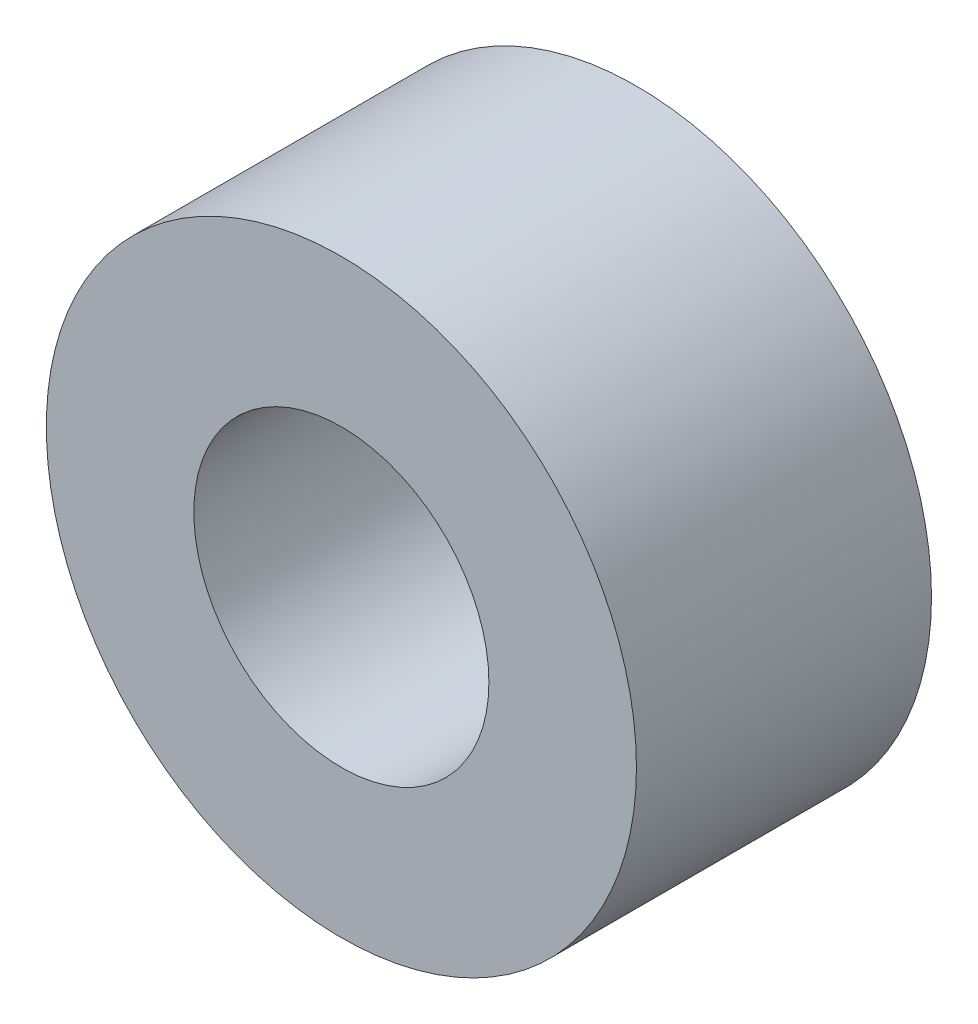
ISO-10303-21;
HEADER;
FILE_DESCRIPTION(('STEP AP214'),'2;1');
FILE_NAME('part.step','',(''),(''),'','','');
FILE_SCHEMA(('AUTOMOTIVE_DESIGN { 1 0 10303 214 1 1 1 1 }'));
ENDSEC;
DATA;
#1=APPLICATION_CONTEXT('core data for automotive mechanical design processes');
#2=APPLICATION_PROTOCOL_DEFINITION('international standard','automotive_design',2000,#1);
#3=PRODUCT_CONTEXT('',#1,'mechanical');
#4=PRODUCT('Part','Part','',(#3));
#5=PRODUCT_RELATED_PRODUCT_CATEGORY('part','',(#4));
#6=PRODUCT_DEFINITION_FORMATION('','',#4);
#7=PRODUCT_DEFINITION_CONTEXT('part definition',#1,'design');
#8=PRODUCT_DEFINITION('design','',#6,#7);
#9=PRODUCT_DEFINITION_SHAPE('','',#8);
#10=(LENGTH_UNIT() NAMED_UNIT(*) SI_UNIT(.MILLI.,.METRE.));
#11=(NAMED_UNIT(*) PLANE_ANGLE_UNIT() SI_UNIT($,.RADIAN.));
#12=(NAMED_UNIT(*) SI_UNIT($,.STERADIAN.) SOLID_ANGLE_UNIT());
#13=UNCERTAINTY_MEASURE_WITH_UNIT(LENGTH_MEASURE(1.E-05),#10,'distance_accuracy_value','');
#14=(GEOMETRIC_REPRESENTATION_CONTEXT(3) GLOBAL_UNCERTAINTY_ASSIGNED_CONTEXT((#13)) GLOBAL_UNIT_ASSIGNED_CONTEXT((#10,
#11,#12)) REPRESENTATION_CONTEXT('',''));
#15=CARTESIAN_POINT('',(0.,0.,0.));
#16=DIRECTION('',(0.,0.,1.));
#17=DIRECTION('',(1.,0.,0.));
#18=AXIS2_PLACEMENT_3D('',#15,#16,#17);
#19=CARTESIAN_POINT('',(0.,0.,6.35));
#20=DIRECTION('',(0.,0.,-1.));
#21=DIRECTION('',(-1.,0.,0.));
#22=AXIS2_PLACEMENT_3D('',#19,#20,#21);
#23=CYLINDRICAL_SURFACE('',#22,6.35);
#24=CARTESIAN_POINT('',(0.,0.,6.35));
#25=DIRECTION('',(0.,0.,1.));
#26=DIRECTION('',(1.,0.,0.));
#27=AXIS2_PLACEMENT_3D('',#24,#25,#26);
#28=CIRCLE('',#27,6.35);
#29=CARTESIAN_POINT('',(6.35,0.,6.35));
#30=VERTEX_POINT('',#29);
#31=EDGE_CURVE('E10',#30,#30,#28,.T.);
#32=ORIENTED_EDGE('',*,*,#31,.F.);
#33=EDGE_LOOP('',(#32));
#34=FACE_BOUND('',#33,.T.);
#35=CARTESIAN_POINT('',(0.,0.,0.));
#36=DIRECTION('',(0.,0.,1.));
#37=DIRECTION('',(1.,0.,0.));
#38=AXIS2_PLACEMENT_3D('',#35,#36,#37);
#39=CIRCLE('',#38,6.35);
#40=CARTESIAN_POINT('',(6.35,0.,0.));
#41=VERTEX_POINT('',#40);
#42=EDGE_CURVE('E40',#41,#41,#39,.T.);
#43=ORIENTED_EDGE('',*,*,#42,.T.);
#44=EDGE_LOOP('',(#43));
#45=FACE_BOUND('',#44,.T.);
#46=ADVANCED_FACE('F37',(#34,#45),#23,.T.);
#47=CARTESIAN_POINT('',(0.,0.,6.35));
#48=DIRECTION('',(0.,0.,1.));
#49=DIRECTION('',(1.,0.,0.));
#50=AXIS2_PLACEMENT_3D('',#47,#48,#49);
#51=PLANE('',#50);
#52=CARTESIAN_POINT('',(0.,0.,6.35));
#53=DIRECTION('',(0.,0.,1.));
#54=DIRECTION('',(1.,0.,0.));
#55=AXIS2_PLACEMENT_3D('',#52,#53,#54);
#56=CIRCLE('',#55,3.175);
#57=CARTESIAN_POINT('',(3.175,0.,6.35));
#58=VERTEX_POINT('',#57);
#59=EDGE_CURVE('E51',#58,#58,#56,.T.);
#60=ORIENTED_EDGE('',*,*,#59,.F.);
#61=EDGE_LOOP('',(#60));
#62=FACE_BOUND('',#61,.T.);
#63=ORIENTED_EDGE('',*,*,#31,.T.);
#64=EDGE_LOOP('',(#63));
#65=FACE_BOUND('',#64,.T.);
#66=ADVANCED_FACE('F68',(#62,#65),#51,.T.);
#67=CARTESIAN_POINT('',(0.,0.,0.));
#68=DIRECTION('',(0.,0.,1.));
#69=DIRECTION('',(1.,0.,0.));
#70=AXIS2_PLACEMENT_3D('',#67,#68,#69);
#71=PLANE('',#70);
#72=CARTESIAN_POINT('',(0.,0.,0.));
#73=DIRECTION('',(0.,0.,1.));
#74=DIRECTION('',(1.,0.,0.));
#75=AXIS2_PLACEMENT_3D('',#72,#73,#74);
#76=CIRCLE('',#75,3.175);
#77=CARTESIAN_POINT('',(3.175,0.,0.));
#78=VERTEX_POINT('',#77);
#79=EDGE_CURVE('E49',#78,#78,#76,.T.);
#80=ORIENTED_EDGE('',*,*,#79,.T.);
#81=EDGE_LOOP('',(#80));
#82=FACE_BOUND('',#81,.T.);
#83=ORIENTED_EDGE('',*,*,#42,.F.);
#84=EDGE_LOOP('',(#83));
#85=FACE_BOUND('',#84,.T.);
#86=ADVANCED_FACE('F59',(#82,#85),#71,.F.);
#87=CARTESIAN_POINT('',(0.,0.,0.));
#88=DIRECTION('',(0.,0.,1.));
#89=DIRECTION('',(1.,0.,0.));
#90=AXIS2_PLACEMENT_3D('',#87,#88,#89);
#91=CYLINDRICAL_SURFACE('',#90,3.175);
#92=ORIENTED_EDGE('',*,*,#79,.F.);
#93=EDGE_LOOP('',(#92));
#94=FACE_BOUND('',#93,.T.);
#95=ORIENTED_EDGE('',*,*,#59,.T.);
#96=EDGE_LOOP('',(#95));
#97=FACE_BOUND('',#96,.T.);
#98=ADVANCED_FACE('F62',(#94,#97),#91,.F.);
#99=CLOSED_SHELL('',(#46,#66,#86,#98));
#100=MANIFOLD_SOLID_BREP('B2',#99);
#101=ADVANCED_BREP_SHAPE_REPRESENTATION('',(#18,#100),#14);
#102=SHAPE_DEFINITION_REPRESENTATION(#9,#101);
ENDSEC;
END-ISO-10303-21;
